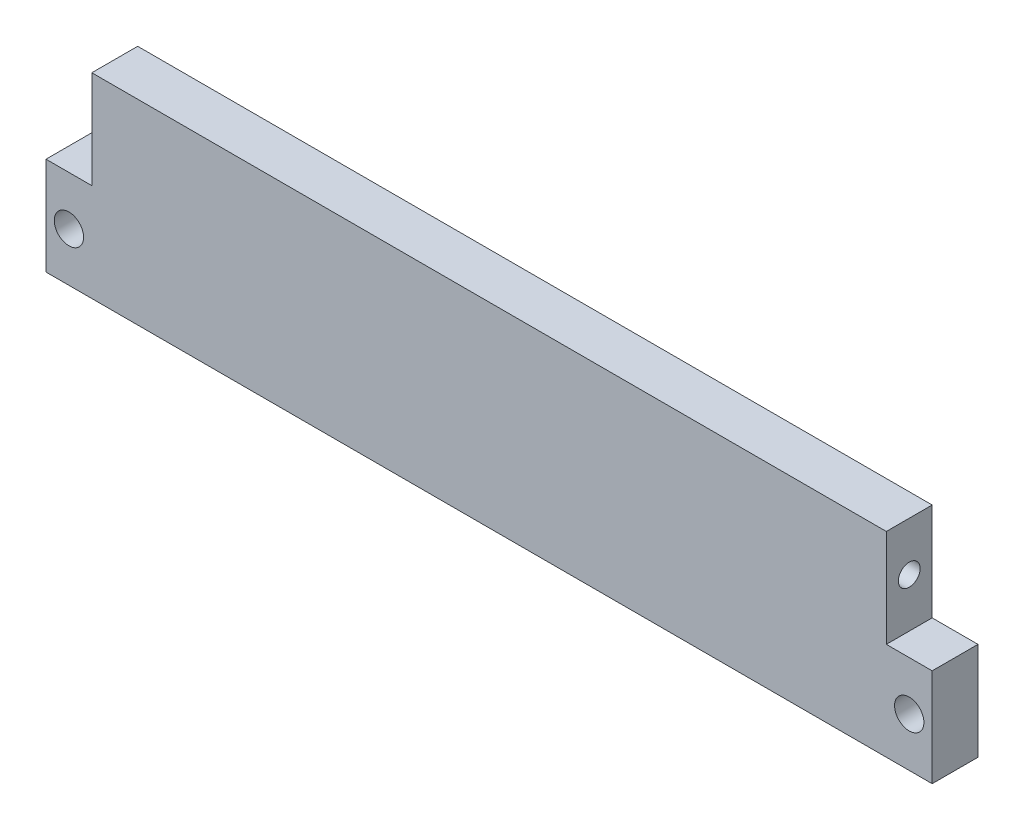
ISO-10303-21;
HEADER;
FILE_DESCRIPTION(('STEP AP214'),'2;1');
FILE_NAME('part.step','',(''),(''),'','','');
FILE_SCHEMA(('AUTOMOTIVE_DESIGN { 1 0 10303 214 1 1 1 1 }'));
ENDSEC;
DATA;
#1=APPLICATION_CONTEXT('core data for automotive mechanical design processes');
#2=APPLICATION_PROTOCOL_DEFINITION('international standard','automotive_design',2000,#1);
#3=PRODUCT_CONTEXT('',#1,'mechanical');
#4=PRODUCT('Part','Part','',(#3));
#5=PRODUCT_RELATED_PRODUCT_CATEGORY('part','',(#4));
#6=PRODUCT_DEFINITION_FORMATION('','',#4);
#7=PRODUCT_DEFINITION_CONTEXT('part definition',#1,'design');
#8=PRODUCT_DEFINITION('design','',#6,#7);
#9=PRODUCT_DEFINITION_SHAPE('','',#8);
#10=(LENGTH_UNIT() NAMED_UNIT(*) SI_UNIT(.MILLI.,.METRE.));
#11=(NAMED_UNIT(*) PLANE_ANGLE_UNIT() SI_UNIT($,.RADIAN.));
#12=(NAMED_UNIT(*) SI_UNIT($,.STERADIAN.) SOLID_ANGLE_UNIT());
#13=UNCERTAINTY_MEASURE_WITH_UNIT(LENGTH_MEASURE(1.E-05),#10,'distance_accuracy_value','');
#14=(GEOMETRIC_REPRESENTATION_CONTEXT(3) GLOBAL_UNCERTAINTY_ASSIGNED_CONTEXT((#13)) GLOBAL_UNIT_ASSIGNED_CONTEXT((#10,
#11,#12)) REPRESENTATION_CONTEXT('',''));
#15=CARTESIAN_POINT('',(0.,0.,0.));
#16=DIRECTION('',(0.,0.,1.));
#17=DIRECTION('',(1.,0.,0.));
#18=AXIS2_PLACEMENT_3D('',#15,#16,#17);
#19=CARTESIAN_POINT('',(-46.0375,0.,4.7625));
#20=DIRECTION('',(0.,0.,1.));
#21=DIRECTION('',(1.,0.,0.));
#22=AXIS2_PLACEMENT_3D('',#19,#20,#21);
#23=PLANE('',#22);
#24=CARTESIAN_POINT('',(-43.65625,5.07999999999999,4.7625));
#25=DIRECTION('',(0.,0.,1.));
#26=DIRECTION('',(1.,0.,0.));
#27=AXIS2_PLACEMENT_3D('',#24,#25,#26);
#28=CIRCLE('',#27,1.524);
#29=CARTESIAN_POINT('',(-45.18025,5.07999999999999,4.7625));
#30=VERTEX_POINT('',#29);
#31=EDGE_CURVE('E134',#30,#30,#28,.T.);
#32=ORIENTED_EDGE('',*,*,#31,.F.);
#33=EDGE_LOOP('',(#32));
#34=FACE_BOUND('',#33,.T.);
#35=DIRECTION('',(0.,-1.,0.));
#36=VECTOR('',#35,1.);
#37=CARTESIAN_POINT('',(-46.0375,10.16,4.7625));
#38=LINE('',#37,#36);
#39=CARTESIAN_POINT('',(-46.0375,10.16,4.7625));
#40=VERTEX_POINT('',#39);
#41=CARTESIAN_POINT('',(-46.0375,0.,4.7625));
#42=VERTEX_POINT('',#41);
#43=EDGE_CURVE('E145',#40,#42,#38,.T.);
#44=ORIENTED_EDGE('',*,*,#43,.T.);
#45=DIRECTION('',(1.,0.,0.));
#46=VECTOR('',#45,1.);
#47=CARTESIAN_POINT('',(-46.0375,0.,4.7625));
#48=LINE('',#47,#46);
#49=CARTESIAN_POINT('',(46.0375,0.,4.7625));
#50=VERTEX_POINT('',#49);
#51=EDGE_CURVE('E93',#42,#50,#48,.T.);
#52=ORIENTED_EDGE('',*,*,#51,.T.);
#53=DIRECTION('',(0.,1.,0.));
#54=VECTOR('',#53,1.);
#55=CARTESIAN_POINT('',(46.0375,0.,4.7625));
#56=LINE('',#55,#54);
#57=CARTESIAN_POINT('',(46.0375,10.16,4.7625));
#58=VERTEX_POINT('',#57);
#59=EDGE_CURVE('E160',#50,#58,#56,.T.);
#60=ORIENTED_EDGE('',*,*,#59,.T.);
#61=DIRECTION('',(-1.,0.,0.));
#62=VECTOR('',#61,1.);
#63=CARTESIAN_POINT('',(46.0375,10.16,4.7625));
#64=LINE('',#63,#62);
#65=CARTESIAN_POINT('',(41.275,10.16,4.7625));
#66=VERTEX_POINT('',#65);
#67=EDGE_CURVE('E173',#58,#66,#64,.T.);
#68=ORIENTED_EDGE('',*,*,#67,.T.);
#69=DIRECTION('',(0.,1.,0.));
#70=VECTOR('',#69,1.);
#71=CARTESIAN_POINT('',(41.275,10.16,4.7625));
#72=LINE('',#71,#70);
#73=CARTESIAN_POINT('',(41.275,20.32,4.7625));
#74=VERTEX_POINT('',#73);
#75=EDGE_CURVE('E112',#66,#74,#72,.T.);
#76=ORIENTED_EDGE('',*,*,#75,.T.);
#77=DIRECTION('',(-1.,0.,0.));
#78=VECTOR('',#77,1.);
#79=CARTESIAN_POINT('',(41.275,20.32,4.7625));
#80=LINE('',#79,#78);
#81=CARTESIAN_POINT('',(-41.275,20.32,4.7625));
#82=VERTEX_POINT('',#81);
#83=EDGE_CURVE('E106',#74,#82,#80,.T.);
#84=ORIENTED_EDGE('',*,*,#83,.T.);
#85=DIRECTION('',(0.,-1.,0.));
#86=VECTOR('',#85,1.);
#87=CARTESIAN_POINT('',(-41.275,20.32,4.7625));
#88=LINE('',#87,#86);
#89=CARTESIAN_POINT('',(-41.275,10.16,4.7625));
#90=VERTEX_POINT('',#89);
#91=EDGE_CURVE('E110',#82,#90,#88,.T.);
#92=ORIENTED_EDGE('',*,*,#91,.T.);
#93=DIRECTION('',(-1.,0.,0.));
#94=VECTOR('',#93,1.);
#95=CARTESIAN_POINT('',(-41.275,10.16,4.7625));
#96=LINE('',#95,#94);
#97=EDGE_CURVE('E50',#90,#40,#96,.T.);
#98=ORIENTED_EDGE('',*,*,#97,.T.);
#99=EDGE_LOOP('',(#44,#52,#60,#68,#76,#84,#92,#98));
#100=FACE_BOUND('',#99,.T.);
#101=CARTESIAN_POINT('',(43.65625,5.08000000000044,4.7625));
#102=DIRECTION('',(0.,0.,1.));
#103=DIRECTION('',(-1.,0.,0.));
#104=AXIS2_PLACEMENT_3D('',#101,#102,#103);
#105=CIRCLE('',#104,1.524);
#106=CARTESIAN_POINT('',(42.13225,5.08000000000044,4.7625));
#107=VERTEX_POINT('',#106);
#108=EDGE_CURVE('E182',#107,#107,#105,.T.);
#109=ORIENTED_EDGE('',*,*,#108,.F.);
#110=EDGE_LOOP('',(#109));
#111=FACE_BOUND('',#110,.T.);
#112=ADVANCED_FACE('F33',(#34,#100,#111),#23,.T.);
#113=CARTESIAN_POINT('',(-46.0375,0.,0.));
#114=DIRECTION('',(0.,0.,1.));
#115=DIRECTION('',(1.,0.,0.));
#116=AXIS2_PLACEMENT_3D('',#113,#114,#115);
#117=PLANE('',#116);
#118=CARTESIAN_POINT('',(-43.65625,5.07999999999999,0.));
#119=DIRECTION('',(0.,0.,1.));
#120=DIRECTION('',(1.,0.,0.));
#121=AXIS2_PLACEMENT_3D('',#118,#119,#120);
#122=CIRCLE('',#121,1.524);
#123=CARTESIAN_POINT('',(-45.18025,5.07999999999999,0.));
#124=VERTEX_POINT('',#123);
#125=EDGE_CURVE('E179',#124,#124,#122,.T.);
#126=ORIENTED_EDGE('',*,*,#125,.T.);
#127=EDGE_LOOP('',(#126));
#128=FACE_BOUND('',#127,.T.);
#129=DIRECTION('',(0.,-1.,0.));
#130=VECTOR('',#129,1.);
#131=CARTESIAN_POINT('',(-46.0375,10.16,0.));
#132=LINE('',#131,#130);
#133=CARTESIAN_POINT('',(-46.0375,10.16,0.));
#134=VERTEX_POINT('',#133);
#135=CARTESIAN_POINT('',(-46.0375,0.,0.));
#136=VERTEX_POINT('',#135);
#137=EDGE_CURVE('E130',#134,#136,#132,.T.);
#138=ORIENTED_EDGE('',*,*,#137,.F.);
#139=DIRECTION('',(-1.,0.,0.));
#140=VECTOR('',#139,1.);
#141=CARTESIAN_POINT('',(-41.275,10.16,0.));
#142=LINE('',#141,#140);
#143=CARTESIAN_POINT('',(-41.275,10.16,0.));
#144=VERTEX_POINT('',#143);
#145=EDGE_CURVE('E85',#144,#134,#142,.T.);
#146=ORIENTED_EDGE('',*,*,#145,.F.);
#147=DIRECTION('',(0.,-1.,0.));
#148=VECTOR('',#147,1.);
#149=CARTESIAN_POINT('',(-41.275,20.32,0.));
#150=LINE('',#149,#148);
#151=CARTESIAN_POINT('',(-41.275,20.32,0.));
#152=VERTEX_POINT('',#151);
#153=EDGE_CURVE('E79',#152,#144,#150,.T.);
#154=ORIENTED_EDGE('',*,*,#153,.F.);
#155=DIRECTION('',(-1.,0.,0.));
#156=VECTOR('',#155,1.);
#157=CARTESIAN_POINT('',(41.275,20.32,0.));
#158=LINE('',#157,#156);
#159=CARTESIAN_POINT('',(41.275,20.32,0.));
#160=VERTEX_POINT('',#159);
#161=EDGE_CURVE('E120',#160,#152,#158,.T.);
#162=ORIENTED_EDGE('',*,*,#161,.F.);
#163=DIRECTION('',(0.,1.,0.));
#164=VECTOR('',#163,1.);
#165=CARTESIAN_POINT('',(41.275,10.16,0.));
#166=LINE('',#165,#164);
#167=CARTESIAN_POINT('',(41.275,10.16,0.));
#168=VERTEX_POINT('',#167);
#169=EDGE_CURVE('E140',#168,#160,#166,.T.);
#170=ORIENTED_EDGE('',*,*,#169,.F.);
#171=DIRECTION('',(-1.,0.,0.));
#172=VECTOR('',#171,1.);
#173=CARTESIAN_POINT('',(46.0375,10.16,0.));
#174=LINE('',#173,#172);
#175=CARTESIAN_POINT('',(46.0375,10.16,0.));
#176=VERTEX_POINT('',#175);
#177=EDGE_CURVE('E138',#176,#168,#174,.T.);
#178=ORIENTED_EDGE('',*,*,#177,.F.);
#179=DIRECTION('',(0.,1.,0.));
#180=VECTOR('',#179,1.);
#181=CARTESIAN_POINT('',(46.0375,0.,0.));
#182=LINE('',#181,#180);
#183=CARTESIAN_POINT('',(46.0375,0.,0.));
#184=VERTEX_POINT('',#183);
#185=EDGE_CURVE('E136',#184,#176,#182,.T.);
#186=ORIENTED_EDGE('',*,*,#185,.F.);
#187=DIRECTION('',(1.,0.,0.));
#188=VECTOR('',#187,1.);
#189=CARTESIAN_POINT('',(-46.0375,0.,0.));
#190=LINE('',#189,#188);
#191=EDGE_CURVE('E133',#136,#184,#190,.T.);
#192=ORIENTED_EDGE('',*,*,#191,.F.);
#193=EDGE_LOOP('',(#138,#146,#154,#162,#170,#178,#186,#192));
#194=FACE_BOUND('',#193,.T.);
#195=CARTESIAN_POINT('',(43.65625,5.08000000000044,0.));
#196=DIRECTION('',(0.,0.,1.));
#197=DIRECTION('',(-1.,0.,0.));
#198=AXIS2_PLACEMENT_3D('',#195,#196,#197);
#199=CIRCLE('',#198,1.524);
#200=CARTESIAN_POINT('',(42.13225,5.08000000000044,0.));
#201=VERTEX_POINT('',#200);
#202=EDGE_CURVE('E185',#201,#201,#199,.T.);
#203=ORIENTED_EDGE('',*,*,#202,.T.);
#204=EDGE_LOOP('',(#203));
#205=FACE_BOUND('',#204,.T.);
#206=ADVANCED_FACE('F164',(#128,#194,#205),#117,.F.);
#207=CARTESIAN_POINT('',(-46.0375,10.16,4.7625));
#208=DIRECTION('',(1.,0.,0.));
#209=DIRECTION('',(0.,0.,-1.));
#210=AXIS2_PLACEMENT_3D('',#207,#208,#209);
#211=PLANE('',#210);
#212=ORIENTED_EDGE('',*,*,#137,.T.);
#213=DIRECTION('',(0.,0.,-1.));
#214=VECTOR('',#213,1.);
#215=CARTESIAN_POINT('',(-46.0375,0.,4.7625));
#216=LINE('',#215,#214);
#217=EDGE_CURVE('E11',#42,#136,#216,.T.);
#218=ORIENTED_EDGE('',*,*,#217,.F.);
#219=ORIENTED_EDGE('',*,*,#43,.F.);
#220=DIRECTION('',(0.,0.,-1.));
#221=VECTOR('',#220,1.);
#222=CARTESIAN_POINT('',(-46.0375,10.16,4.7625));
#223=LINE('',#222,#221);
#224=EDGE_CURVE('E126',#40,#134,#223,.T.);
#225=ORIENTED_EDGE('',*,*,#224,.T.);
#226=EDGE_LOOP('',(#212,#218,#219,#225));
#227=FACE_BOUND('',#226,.T.);
#228=ADVANCED_FACE('F35',(#227),#211,.F.);
#229=CARTESIAN_POINT('',(-46.0375,0.,4.7625));
#230=DIRECTION('',(0.,1.,0.));
#231=DIRECTION('',(-1.,0.,0.));
#232=AXIS2_PLACEMENT_3D('',#229,#230,#231);
#233=PLANE('',#232);
#234=ORIENTED_EDGE('',*,*,#191,.T.);
#235=DIRECTION('',(0.,0.,-1.));
#236=VECTOR('',#235,1.);
#237=CARTESIAN_POINT('',(46.0375,0.,4.7625));
#238=LINE('',#237,#236);
#239=EDGE_CURVE('E42',#50,#184,#238,.T.);
#240=ORIENTED_EDGE('',*,*,#239,.F.);
#241=ORIENTED_EDGE('',*,*,#51,.F.);
#242=ORIENTED_EDGE('',*,*,#217,.T.);
#243=EDGE_LOOP('',(#234,#240,#241,#242));
#244=FACE_BOUND('',#243,.T.);
#245=ADVANCED_FACE('F300',(#244),#233,.F.);
#246=CARTESIAN_POINT('',(46.0375,0.,4.7625));
#247=DIRECTION('',(-1.,0.,0.));
#248=DIRECTION('',(0.,0.,1.));
#249=AXIS2_PLACEMENT_3D('',#246,#247,#248);
#250=PLANE('',#249);
#251=ORIENTED_EDGE('',*,*,#185,.T.);
#252=DIRECTION('',(0.,0.,-1.));
#253=VECTOR('',#252,1.);
#254=CARTESIAN_POINT('',(46.0375,10.16,4.7625));
#255=LINE('',#254,#253);
#256=EDGE_CURVE('E152',#58,#176,#255,.T.);
#257=ORIENTED_EDGE('',*,*,#256,.F.);
#258=ORIENTED_EDGE('',*,*,#59,.F.);
#259=ORIENTED_EDGE('',*,*,#239,.T.);
#260=EDGE_LOOP('',(#251,#257,#258,#259));
#261=FACE_BOUND('',#260,.T.);
#262=ADVANCED_FACE('F158',(#261),#250,.F.);
#263=CARTESIAN_POINT('',(46.0375,10.16,4.7625));
#264=DIRECTION('',(0.,-1.,0.));
#265=DIRECTION('',(1.,0.,0.));
#266=AXIS2_PLACEMENT_3D('',#263,#264,#265);
#267=PLANE('',#266);
#268=ORIENTED_EDGE('',*,*,#177,.T.);
#269=DIRECTION('',(0.,0.,-1.));
#270=VECTOR('',#269,1.);
#271=CARTESIAN_POINT('',(41.275,10.16,4.7625));
#272=LINE('',#271,#270);
#273=EDGE_CURVE('E149',#66,#168,#272,.T.);
#274=ORIENTED_EDGE('',*,*,#273,.F.);
#275=ORIENTED_EDGE('',*,*,#67,.F.);
#276=ORIENTED_EDGE('',*,*,#256,.T.);
#277=EDGE_LOOP('',(#268,#274,#275,#276));
#278=FACE_BOUND('',#277,.T.);
#279=ADVANCED_FACE('F169',(#278),#267,.F.);
#280=CARTESIAN_POINT('',(41.275,10.16,4.7625));
#281=DIRECTION('',(-1.,0.,0.));
#282=DIRECTION('',(0.,-1.,0.));
#283=AXIS2_PLACEMENT_3D('',#280,#281,#282);
#284=PLANE('',#283);
#285=CARTESIAN_POINT('',(41.275,15.24,2.38125));
#286=DIRECTION('',(1.,0.,0.));
#287=DIRECTION('',(0.,1.,0.));
#288=AXIS2_PLACEMENT_3D('',#285,#286,#287);
#289=CIRCLE('',#288,1.1303);
#290=CARTESIAN_POINT('',(41.275,16.3703,2.38125));
#291=VERTEX_POINT('',#290);
#292=EDGE_CURVE('E191',#291,#291,#289,.T.);
#293=ORIENTED_EDGE('',*,*,#292,.F.);
#294=EDGE_LOOP('',(#293));
#295=FACE_BOUND('',#294,.T.);
#296=ORIENTED_EDGE('',*,*,#169,.T.);
#297=DIRECTION('',(0.,0.,-1.));
#298=VECTOR('',#297,1.);
#299=CARTESIAN_POINT('',(41.275,20.32,4.7625));
#300=LINE('',#299,#298);
#301=EDGE_CURVE('E121',#74,#160,#300,.T.);
#302=ORIENTED_EDGE('',*,*,#301,.F.);
#303=ORIENTED_EDGE('',*,*,#75,.F.);
#304=ORIENTED_EDGE('',*,*,#273,.T.);
#305=EDGE_LOOP('',(#296,#302,#303,#304));
#306=FACE_BOUND('',#305,.T.);
#307=ADVANCED_FACE('F172',(#295,#306),#284,.F.);
#308=CARTESIAN_POINT('',(41.275,20.32,4.7625));
#309=DIRECTION('',(0.,-1.,0.));
#310=DIRECTION('',(1.,0.,0.));
#311=AXIS2_PLACEMENT_3D('',#308,#309,#310);
#312=PLANE('',#311);
#313=ORIENTED_EDGE('',*,*,#161,.T.);
#314=DIRECTION('',(0.,0.,-1.));
#315=VECTOR('',#314,1.);
#316=CARTESIAN_POINT('',(-41.275,20.32,4.7625));
#317=LINE('',#316,#315);
#318=EDGE_CURVE('E117',#82,#152,#317,.T.);
#319=ORIENTED_EDGE('',*,*,#318,.F.);
#320=ORIENTED_EDGE('',*,*,#83,.F.);
#321=ORIENTED_EDGE('',*,*,#301,.T.);
#322=EDGE_LOOP('',(#313,#319,#320,#321));
#323=FACE_BOUND('',#322,.T.);
#324=ADVANCED_FACE('F118',(#323),#312,.F.);
#325=CARTESIAN_POINT('',(-41.275,20.32,4.7625));
#326=DIRECTION('',(1.,0.,0.));
#327=DIRECTION('',(0.,0.,-1.));
#328=AXIS2_PLACEMENT_3D('',#325,#326,#327);
#329=PLANE('',#328);
#330=CARTESIAN_POINT('',(-41.275,15.24,2.38125));
#331=DIRECTION('',(-1.,0.,0.));
#332=DIRECTION('',(0.,0.,1.));
#333=AXIS2_PLACEMENT_3D('',#330,#331,#332);
#334=CIRCLE('',#333,1.1303);
#335=CARTESIAN_POINT('',(-41.275,15.24,3.51155));
#336=VERTEX_POINT('',#335);
#337=EDGE_CURVE('E197',#336,#336,#334,.T.);
#338=ORIENTED_EDGE('',*,*,#337,.F.);
#339=EDGE_LOOP('',(#338));
#340=FACE_BOUND('',#339,.T.);
#341=ORIENTED_EDGE('',*,*,#153,.T.);
#342=DIRECTION('',(0.,0.,-1.));
#343=VECTOR('',#342,1.);
#344=CARTESIAN_POINT('',(-41.275,10.16,4.7625));
#345=LINE('',#344,#343);
#346=EDGE_CURVE('E122',#90,#144,#345,.T.);
#347=ORIENTED_EDGE('',*,*,#346,.F.);
#348=ORIENTED_EDGE('',*,*,#91,.F.);
#349=ORIENTED_EDGE('',*,*,#318,.T.);
#350=EDGE_LOOP('',(#341,#347,#348,#349));
#351=FACE_BOUND('',#350,.T.);
#352=ADVANCED_FACE('F124',(#340,#351),#329,.F.);
#353=CARTESIAN_POINT('',(-41.275,10.16,4.7625));
#354=DIRECTION('',(0.,-1.,0.));
#355=DIRECTION('',(0.,0.,-1.));
#356=AXIS2_PLACEMENT_3D('',#353,#354,#355);
#357=PLANE('',#356);
#358=ORIENTED_EDGE('',*,*,#145,.T.);
#359=ORIENTED_EDGE('',*,*,#224,.F.);
#360=ORIENTED_EDGE('',*,*,#97,.F.);
#361=ORIENTED_EDGE('',*,*,#346,.T.);
#362=EDGE_LOOP('',(#358,#359,#360,#361));
#363=FACE_BOUND('',#362,.T.);
#364=ADVANCED_FACE('F213',(#363),#357,.F.);
#365=CARTESIAN_POINT('',(-43.65625,5.07999999999999,4.7625));
#366=DIRECTION('',(0.,0.,-1.));
#367=DIRECTION('',(-1.,0.,0.));
#368=AXIS2_PLACEMENT_3D('',#365,#366,#367);
#369=CYLINDRICAL_SURFACE('',#368,1.524);
#370=CARTESIAN_POINT('',(-45.18025,5.07999999999999,4.7625));
#371=CARTESIAN_POINT('',(-45.18025,5.07999999999999,4.712890625));
#372=CARTESIAN_POINT('',(-45.18025,5.07999999999999,4.66328125));
#373=CARTESIAN_POINT('',(-45.18025,5.07999999999999,4.5640625));
#374=CARTESIAN_POINT('',(-45.18025,5.07999999999999,4.514453125));
#375=CARTESIAN_POINT('',(-45.18025,5.07999999999999,4.415234375));
#376=CARTESIAN_POINT('',(-45.18025,5.07999999999999,4.365625));
#377=CARTESIAN_POINT('',(-45.18025,5.07999999999999,4.26640625));
#378=CARTESIAN_POINT('',(-45.18025,5.07999999999999,4.216796875));
#379=CARTESIAN_POINT('',(-45.18025,5.07999999999999,4.117578125));
#380=CARTESIAN_POINT('',(-45.18025,5.07999999999999,4.06796875));
#381=CARTESIAN_POINT('',(-45.18025,5.07999999999999,3.96875));
#382=CARTESIAN_POINT('',(-45.18025,5.07999999999999,3.919140625));
#383=CARTESIAN_POINT('',(-45.18025,5.07999999999999,3.819921875));
#384=CARTESIAN_POINT('',(-45.18025,5.07999999999999,3.7703125));
#385=CARTESIAN_POINT('',(-45.18025,5.07999999999999,3.67109375));
#386=CARTESIAN_POINT('',(-45.18025,5.07999999999999,3.621484375));
#387=CARTESIAN_POINT('',(-45.18025,5.07999999999999,3.522265625));
#388=CARTESIAN_POINT('',(-45.18025,5.07999999999999,3.47265625));
#389=CARTESIAN_POINT('',(-45.18025,5.07999999999999,3.3734375));
#390=CARTESIAN_POINT('',(-45.18025,5.07999999999999,3.323828125));
#391=CARTESIAN_POINT('',(-45.18025,5.07999999999999,3.224609375));
#392=CARTESIAN_POINT('',(-45.18025,5.07999999999999,3.175));
#393=CARTESIAN_POINT('',(-45.18025,5.07999999999999,3.07578125));
#394=CARTESIAN_POINT('',(-45.18025,5.07999999999999,3.026171875));
#395=CARTESIAN_POINT('',(-45.18025,5.07999999999999,2.926953125));
#396=CARTESIAN_POINT('',(-45.18025,5.07999999999999,2.87734375));
#397=CARTESIAN_POINT('',(-45.18025,5.07999999999999,2.778125));
#398=CARTESIAN_POINT('',(-45.18025,5.07999999999999,2.728515625));
#399=CARTESIAN_POINT('',(-45.18025,5.07999999999999,2.629296875));
#400=CARTESIAN_POINT('',(-45.18025,5.07999999999999,2.5796875));
#401=CARTESIAN_POINT('',(-45.18025,5.07999999999999,2.48046875));
#402=CARTESIAN_POINT('',(-45.18025,5.07999999999999,2.430859375));
#403=CARTESIAN_POINT('',(-45.18025,5.07999999999999,2.331640625));
#404=CARTESIAN_POINT('',(-45.18025,5.07999999999999,2.28203125));
#405=CARTESIAN_POINT('',(-45.18025,5.07999999999999,2.1828125));
#406=CARTESIAN_POINT('',(-45.18025,5.07999999999999,2.133203125));
#407=CARTESIAN_POINT('',(-45.18025,5.07999999999999,2.033984375));
#408=CARTESIAN_POINT('',(-45.18025,5.07999999999999,1.984375));
#409=CARTESIAN_POINT('',(-45.18025,5.07999999999999,1.88515625));
#410=CARTESIAN_POINT('',(-45.18025,5.07999999999999,1.835546875));
#411=CARTESIAN_POINT('',(-45.18025,5.07999999999999,1.736328125));
#412=CARTESIAN_POINT('',(-45.18025,5.07999999999999,1.68671875));
#413=CARTESIAN_POINT('',(-45.18025,5.07999999999999,1.5875));
#414=CARTESIAN_POINT('',(-45.18025,5.07999999999999,1.537890625));
#415=CARTESIAN_POINT('',(-45.18025,5.07999999999999,1.438671875));
#416=CARTESIAN_POINT('',(-45.18025,5.07999999999999,1.3890625));
#417=CARTESIAN_POINT('',(-45.18025,5.07999999999999,1.28984375));
#418=CARTESIAN_POINT('',(-45.18025,5.07999999999999,1.240234375));
#419=CARTESIAN_POINT('',(-45.18025,5.07999999999999,1.141015625));
#420=CARTESIAN_POINT('',(-45.18025,5.07999999999999,1.09140625));
#421=CARTESIAN_POINT('',(-45.18025,5.07999999999999,0.992187499999999));
#422=CARTESIAN_POINT('',(-45.18025,5.07999999999999,0.942578124999999));
#423=CARTESIAN_POINT('',(-45.18025,5.07999999999999,0.843359375));
#424=CARTESIAN_POINT('',(-45.18025,5.07999999999999,0.79375));
#425=CARTESIAN_POINT('',(-45.18025,5.07999999999999,0.69453125));
#426=CARTESIAN_POINT('',(-45.18025,5.07999999999999,0.644921875));
#427=CARTESIAN_POINT('',(-45.18025,5.07999999999999,0.545703125));
#428=CARTESIAN_POINT('',(-45.18025,5.07999999999999,0.49609375));
#429=CARTESIAN_POINT('',(-45.18025,5.07999999999999,0.396875));
#430=CARTESIAN_POINT('',(-45.18025,5.07999999999999,0.347265625));
#431=CARTESIAN_POINT('',(-45.18025,5.07999999999999,0.248046875));
#432=CARTESIAN_POINT('',(-45.18025,5.07999999999999,0.1984375));
#433=CARTESIAN_POINT('',(-45.18025,5.07999999999999,0.09921875));
#434=CARTESIAN_POINT('',(-45.18025,5.07999999999999,0.049609375));
#435=CARTESIAN_POINT('',(-45.18025,5.07999999999999,0.));
#436=B_SPLINE_CURVE_WITH_KNOTS('',3,(#370,#371,#372,#373,#374,#375,#376,#377,#378,#379,#380,
#381,#382,#383,#384,#385,#386,#387,#388,#389,#390,#391,#392,#393,#394,#395,#396,#397,#398,#399,
#400,#401,#402,#403,#404,#405,#406,#407,#408,#409,#410,#411,#412,#413,#414,#415,#416,#417,#418,
#419,#420,#421,#422,#423,#424,#425,#426,#427,#428,#429,#430,#431,#432,#433,#434,#435),
.UNSPECIFIED.,.F.,.F.,(4,2,2,2,2,2,2,2,2,2,2,2,2,2,2,2,2,2,2,2,2,2,2,2,2,2,2,2,2,2,2,2,4),(0.,
0.148828125,0.29765625,0.446484375,0.5953125,0.744140625,0.892968750000001,1.041796875,1.190625,
1.339453125,1.48828125,1.637109375,1.7859375,1.934765625,2.08359375,2.232421875,2.38125,
2.530078125,2.67890625,2.827734375,2.9765625,3.125390625,3.27421875,3.423046875,3.571875,
3.720703125,3.86953125,4.018359375,4.1671875,4.316015625,4.46484375,4.613671875,4.7625),.UNSPECIFIED.);
#437=EDGE_CURVE('BSEAM220',#30,#124,#436,.T.);
#438=ORIENTED_EDGE('',*,*,#31,.T.);
#439=ORIENTED_EDGE('',*,*,#125,.F.);
#440=ORIENTED_EDGE('',*,*,#437,.T.);
#441=ORIENTED_EDGE('',*,*,#437,.F.);
#442=EDGE_LOOP('',(#438,#440,#439,#441));
#443=FACE_BOUND('',#442,.T.);
#444=ADVANCED_FACE('F220',(#443),#369,.F.);
#445=CARTESIAN_POINT('',(43.65625,5.08000000000044,4.7625));
#446=DIRECTION('',(0.,0.,-1.));
#447=DIRECTION('',(-1.,0.,0.));
#448=AXIS2_PLACEMENT_3D('',#445,#446,#447);
#449=CYLINDRICAL_SURFACE('',#448,1.524);
#450=CARTESIAN_POINT('',(42.13225,5.08000000000044,4.7625));
#451=CARTESIAN_POINT('',(42.13225,5.08000000000044,4.712890625));
#452=CARTESIAN_POINT('',(42.13225,5.08000000000044,4.66328125));
#453=CARTESIAN_POINT('',(42.13225,5.08000000000044,4.5640625));
#454=CARTESIAN_POINT('',(42.13225,5.08000000000044,4.514453125));
#455=CARTESIAN_POINT('',(42.13225,5.08000000000044,4.415234375));
#456=CARTESIAN_POINT('',(42.13225,5.08000000000044,4.365625));
#457=CARTESIAN_POINT('',(42.13225,5.08000000000044,4.26640625));
#458=CARTESIAN_POINT('',(42.13225,5.08000000000044,4.216796875));
#459=CARTESIAN_POINT('',(42.13225,5.08000000000044,4.117578125));
#460=CARTESIAN_POINT('',(42.13225,5.08000000000044,4.06796875));
#461=CARTESIAN_POINT('',(42.13225,5.08000000000044,3.96875));
#462=CARTESIAN_POINT('',(42.13225,5.08000000000044,3.919140625));
#463=CARTESIAN_POINT('',(42.13225,5.08000000000044,3.819921875));
#464=CARTESIAN_POINT('',(42.13225,5.08000000000044,3.7703125));
#465=CARTESIAN_POINT('',(42.13225,5.08000000000044,3.67109375));
#466=CARTESIAN_POINT('',(42.13225,5.08000000000044,3.621484375));
#467=CARTESIAN_POINT('',(42.13225,5.08000000000044,3.522265625));
#468=CARTESIAN_POINT('',(42.13225,5.08000000000044,3.47265625));
#469=CARTESIAN_POINT('',(42.13225,5.08000000000044,3.3734375));
#470=CARTESIAN_POINT('',(42.13225,5.08000000000044,3.323828125));
#471=CARTESIAN_POINT('',(42.13225,5.08000000000044,3.224609375));
#472=CARTESIAN_POINT('',(42.13225,5.08000000000044,3.175));
#473=CARTESIAN_POINT('',(42.13225,5.08000000000044,3.07578125));
#474=CARTESIAN_POINT('',(42.13225,5.08000000000044,3.026171875));
#475=CARTESIAN_POINT('',(42.13225,5.08000000000044,2.926953125));
#476=CARTESIAN_POINT('',(42.13225,5.08000000000044,2.87734375));
#477=CARTESIAN_POINT('',(42.13225,5.08000000000044,2.778125));
#478=CARTESIAN_POINT('',(42.13225,5.08000000000044,2.728515625));
#479=CARTESIAN_POINT('',(42.13225,5.08000000000044,2.629296875));
#480=CARTESIAN_POINT('',(42.13225,5.08000000000044,2.5796875));
#481=CARTESIAN_POINT('',(42.13225,5.08000000000044,2.48046875));
#482=CARTESIAN_POINT('',(42.13225,5.08000000000044,2.430859375));
#483=CARTESIAN_POINT('',(42.13225,5.08000000000044,2.331640625));
#484=CARTESIAN_POINT('',(42.13225,5.08000000000044,2.28203125));
#485=CARTESIAN_POINT('',(42.13225,5.08000000000044,2.1828125));
#486=CARTESIAN_POINT('',(42.13225,5.08000000000044,2.133203125));
#487=CARTESIAN_POINT('',(42.13225,5.08000000000044,2.033984375));
#488=CARTESIAN_POINT('',(42.13225,5.08000000000044,1.984375));
#489=CARTESIAN_POINT('',(42.13225,5.08000000000044,1.88515625));
#490=CARTESIAN_POINT('',(42.13225,5.08000000000044,1.835546875));
#491=CARTESIAN_POINT('',(42.13225,5.08000000000044,1.736328125));
#492=CARTESIAN_POINT('',(42.13225,5.08000000000044,1.68671875));
#493=CARTESIAN_POINT('',(42.13225,5.08000000000044,1.5875));
#494=CARTESIAN_POINT('',(42.13225,5.08000000000044,1.537890625));
#495=CARTESIAN_POINT('',(42.13225,5.08000000000044,1.438671875));
#496=CARTESIAN_POINT('',(42.13225,5.08000000000044,1.3890625));
#497=CARTESIAN_POINT('',(42.13225,5.08000000000044,1.28984375));
#498=CARTESIAN_POINT('',(42.13225,5.08000000000044,1.240234375));
#499=CARTESIAN_POINT('',(42.13225,5.08000000000044,1.141015625));
#500=CARTESIAN_POINT('',(42.13225,5.08000000000044,1.09140625));
#501=CARTESIAN_POINT('',(42.13225,5.08000000000044,0.992187499999999));
#502=CARTESIAN_POINT('',(42.13225,5.08000000000044,0.942578124999999));
#503=CARTESIAN_POINT('',(42.13225,5.08000000000044,0.843359375));
#504=CARTESIAN_POINT('',(42.13225,5.08000000000044,0.79375));
#505=CARTESIAN_POINT('',(42.13225,5.08000000000044,0.69453125));
#506=CARTESIAN_POINT('',(42.13225,5.08000000000044,0.644921875));
#507=CARTESIAN_POINT('',(42.13225,5.08000000000044,0.545703125));
#508=CARTESIAN_POINT('',(42.13225,5.08000000000044,0.49609375));
#509=CARTESIAN_POINT('',(42.13225,5.08000000000044,0.396875));
#510=CARTESIAN_POINT('',(42.13225,5.08000000000044,0.347265625));
#511=CARTESIAN_POINT('',(42.13225,5.08000000000044,0.248046875));
#512=CARTESIAN_POINT('',(42.13225,5.08000000000044,0.1984375));
#513=CARTESIAN_POINT('',(42.13225,5.08000000000044,0.09921875));
#514=CARTESIAN_POINT('',(42.13225,5.08000000000044,0.049609375));
#515=CARTESIAN_POINT('',(42.13225,5.08000000000044,0.));
#516=B_SPLINE_CURVE_WITH_KNOTS('',3,(#450,#451,#452,#453,#454,#455,#456,#457,#458,#459,#460,
#461,#462,#463,#464,#465,#466,#467,#468,#469,#470,#471,#472,#473,#474,#475,#476,#477,#478,#479,
#480,#481,#482,#483,#484,#485,#486,#487,#488,#489,#490,#491,#492,#493,#494,#495,#496,#497,#498,
#499,#500,#501,#502,#503,#504,#505,#506,#507,#508,#509,#510,#511,#512,#513,#514,#515),
.UNSPECIFIED.,.F.,.F.,(4,2,2,2,2,2,2,2,2,2,2,2,2,2,2,2,2,2,2,2,2,2,2,2,2,2,2,2,2,2,2,2,4),(0.,
0.148828125,0.29765625,0.446484375,0.5953125,0.744140625,0.892968750000001,1.041796875,1.190625,
1.339453125,1.48828125,1.637109375,1.7859375,1.934765625,2.08359375,2.232421875,2.38125,
2.530078125,2.67890625,2.827734375,2.9765625,3.125390625,3.27421875,3.423046875,3.571875,
3.720703125,3.86953125,4.018359375,4.1671875,4.316015625,4.46484375,4.613671875,4.7625),.UNSPECIFIED.);
#517=EDGE_CURVE('BSEAM236',#107,#201,#516,.T.);
#518=ORIENTED_EDGE('',*,*,#108,.T.);
#519=ORIENTED_EDGE('',*,*,#202,.F.);
#520=ORIENTED_EDGE('',*,*,#517,.T.);
#521=ORIENTED_EDGE('',*,*,#517,.F.);
#522=EDGE_LOOP('',(#518,#520,#519,#521));
#523=FACE_BOUND('',#522,.T.);
#524=ADVANCED_FACE('F236',(#523),#449,.F.);
#525=CARTESIAN_POINT('',(34.925,15.24,2.38125));
#526=DIRECTION('',(1.,0.,0.));
#527=DIRECTION('',(0.,1.,0.));
#528=AXIS2_PLACEMENT_3D('',#525,#526,#527);
#529=CYLINDRICAL_SURFACE('',#528,1.1303);
#530=CARTESIAN_POINT('',(34.925,15.24,2.38125));
#531=DIRECTION('',(1.,0.,0.));
#532=DIRECTION('',(0.,1.,0.));
#533=AXIS2_PLACEMENT_3D('',#530,#531,#532);
#534=CIRCLE('',#533,1.1303);
#535=CARTESIAN_POINT('',(34.925,16.3703,2.38125));
#536=VERTEX_POINT('',#535);
#537=EDGE_CURVE('E188',#536,#536,#534,.T.);
#538=ORIENTED_EDGE('',*,*,#537,.F.);
#539=EDGE_LOOP('',(#538));
#540=FACE_BOUND('',#539,.T.);
#541=ORIENTED_EDGE('',*,*,#292,.T.);
#542=EDGE_LOOP('',(#541));
#543=FACE_BOUND('',#542,.T.);
#544=ADVANCED_FACE('F240',(#540,#543),#529,.F.);
#545=CARTESIAN_POINT('',(34.925,15.24,2.38125));
#546=DIRECTION('',(1.,0.,0.));
#547=DIRECTION('',(0.,1.,0.));
#548=AXIS2_PLACEMENT_3D('',#545,#546,#547);
#549=PLANE('',#548);
#550=ORIENTED_EDGE('',*,*,#537,.T.);
#551=EDGE_LOOP('',(#550));
#552=FACE_BOUND('',#551,.T.);
#553=ADVANCED_FACE('F208',(#552),#549,.T.);
#554=CARTESIAN_POINT('',(-34.925,15.24,2.38125));
#555=DIRECTION('',(-1.,0.,0.));
#556=DIRECTION('',(0.,0.,1.));
#557=AXIS2_PLACEMENT_3D('',#554,#555,#556);
#558=CYLINDRICAL_SURFACE('',#557,1.1303);
#559=CARTESIAN_POINT('',(-34.925,15.24,2.38125));
#560=DIRECTION('',(-1.,0.,0.));
#561=DIRECTION('',(0.,0.,1.));
#562=AXIS2_PLACEMENT_3D('',#559,#560,#561);
#563=CIRCLE('',#562,1.1303);
#564=CARTESIAN_POINT('',(-34.925,15.24,3.51155));
#565=VERTEX_POINT('',#564);
#566=EDGE_CURVE('E194',#565,#565,#563,.T.);
#567=ORIENTED_EDGE('',*,*,#566,.F.);
#568=EDGE_LOOP('',(#567));
#569=FACE_BOUND('',#568,.T.);
#570=ORIENTED_EDGE('',*,*,#337,.T.);
#571=EDGE_LOOP('',(#570));
#572=FACE_BOUND('',#571,.T.);
#573=ADVANCED_FACE('F205',(#569,#572),#558,.F.);
#574=CARTESIAN_POINT('',(-34.925,15.24,2.38125));
#575=DIRECTION('',(-1.,0.,0.));
#576=DIRECTION('',(0.,0.,1.));
#577=AXIS2_PLACEMENT_3D('',#574,#575,#576);
#578=PLANE('',#577);
#579=ORIENTED_EDGE('',*,*,#566,.T.);
#580=EDGE_LOOP('',(#579));
#581=FACE_BOUND('',#580,.T.);
#582=ADVANCED_FACE('F203',(#581),#578,.T.);
#583=CLOSED_SHELL('',(#112,#206,#228,#245,#262,#279,#307,#324,#352,#364,#444,#524,#544,#553,
#573,#582));
#584=MANIFOLD_SOLID_BREP('B2',#583);
#585=ADVANCED_BREP_SHAPE_REPRESENTATION('',(#18,#584),#14);
#586=SHAPE_DEFINITION_REPRESENTATION(#9,#585);
ENDSEC;
END-ISO-10303-21;
